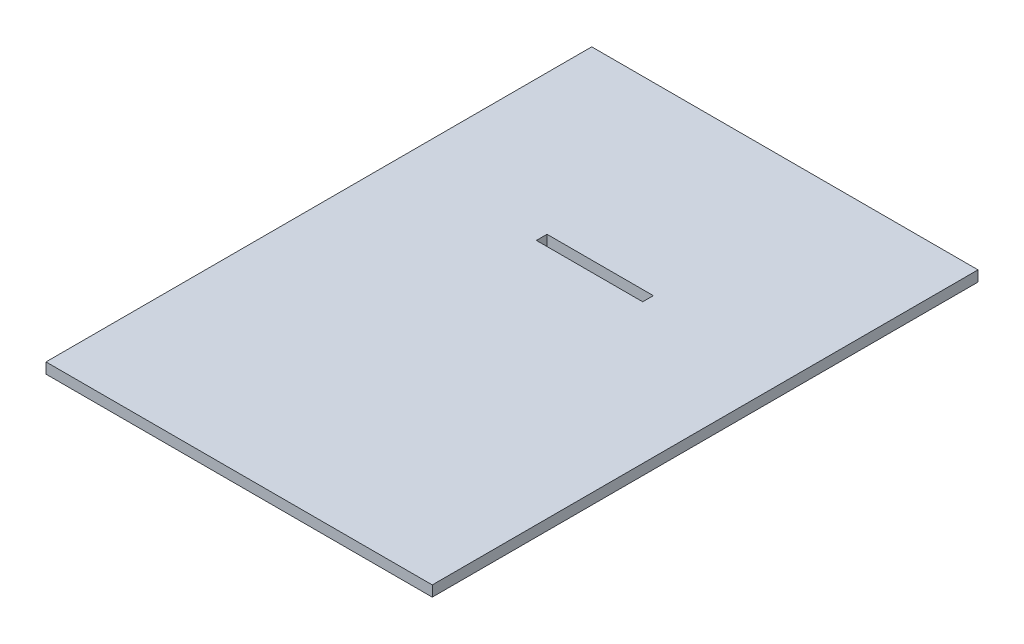
ISO-10303-21;
HEADER;
FILE_DESCRIPTION(('STEP AP214'),'2;1');
FILE_NAME('part.step','',(''),(''),'','','');
FILE_SCHEMA(('AUTOMOTIVE_DESIGN { 1 0 10303 214 1 1 1 1 }'));
ENDSEC;
DATA;
#1=APPLICATION_CONTEXT('core data for automotive mechanical design processes');
#2=APPLICATION_PROTOCOL_DEFINITION('international standard','automotive_design',2000,#1);
#3=PRODUCT_CONTEXT('',#1,'mechanical');
#4=PRODUCT('Part','Part','',(#3));
#5=PRODUCT_RELATED_PRODUCT_CATEGORY('part','',(#4));
#6=PRODUCT_DEFINITION_FORMATION('','',#4);
#7=PRODUCT_DEFINITION_CONTEXT('part definition',#1,'design');
#8=PRODUCT_DEFINITION('design','',#6,#7);
#9=PRODUCT_DEFINITION_SHAPE('','',#8);
#10=(LENGTH_UNIT() NAMED_UNIT(*) SI_UNIT(.MILLI.,.METRE.));
#11=(NAMED_UNIT(*) PLANE_ANGLE_UNIT() SI_UNIT($,.RADIAN.));
#12=(NAMED_UNIT(*) SI_UNIT($,.STERADIAN.) SOLID_ANGLE_UNIT());
#13=UNCERTAINTY_MEASURE_WITH_UNIT(LENGTH_MEASURE(1.E-05),#10,'distance_accuracy_value','');
#14=(GEOMETRIC_REPRESENTATION_CONTEXT(3) GLOBAL_UNCERTAINTY_ASSIGNED_CONTEXT((#13)) GLOBAL_UNIT_ASSIGNED_CONTEXT((#10,
#11,#12)) REPRESENTATION_CONTEXT('',''));
#15=CARTESIAN_POINT('',(0.,0.,0.));
#16=DIRECTION('',(0.,0.,1.));
#17=DIRECTION('',(1.,0.,0.));
#18=AXIS2_PLACEMENT_3D('',#15,#16,#17);
#19=CARTESIAN_POINT('',(0.,3.,0.));
#20=DIRECTION('',(0.,0.,-1.));
#21=DIRECTION('',(-1.,0.,0.));
#22=AXIS2_PLACEMENT_3D('',#19,#20,#21);
#23=PLANE('',#22);
#24=DIRECTION('',(1.,0.,0.));
#25=VECTOR('',#24,1.);
#26=CARTESIAN_POINT('',(0.,0.,0.));
#27=LINE('',#26,#25);
#28=CARTESIAN_POINT('',(0.,0.,0.));
#29=VERTEX_POINT('',#28);
#30=CARTESIAN_POINT('',(109.,0.,0.));
#31=VERTEX_POINT('',#30);
#32=EDGE_CURVE('E134',#29,#31,#27,.T.);
#33=ORIENTED_EDGE('',*,*,#32,.T.);
#34=DIRECTION('',(0.,-1.,0.));
#35=VECTOR('',#34,1.);
#36=CARTESIAN_POINT('',(109.,3.,0.));
#37=LINE('',#36,#35);
#38=CARTESIAN_POINT('',(109.,3.,0.));
#39=VERTEX_POINT('',#38);
#40=EDGE_CURVE('E11',#39,#31,#37,.T.);
#41=ORIENTED_EDGE('',*,*,#40,.F.);
#42=DIRECTION('',(1.,0.,0.));
#43=VECTOR('',#42,1.);
#44=CARTESIAN_POINT('',(0.,3.,0.));
#45=LINE('',#44,#43);
#46=CARTESIAN_POINT('',(0.,3.,0.));
#47=VERTEX_POINT('',#46);
#48=EDGE_CURVE('E138',#47,#39,#45,.T.);
#49=ORIENTED_EDGE('',*,*,#48,.F.);
#50=DIRECTION('',(0.,-1.,0.));
#51=VECTOR('',#50,1.);
#52=CARTESIAN_POINT('',(0.,3.,0.));
#53=LINE('',#52,#51);
#54=EDGE_CURVE('E150',#47,#29,#53,.T.);
#55=ORIENTED_EDGE('',*,*,#54,.T.);
#56=EDGE_LOOP('',(#33,#41,#49,#55));
#57=FACE_BOUND('',#56,.T.);
#58=ADVANCED_FACE('F37',(#57),#23,.F.);
#59=CARTESIAN_POINT('',(109.,3.,0.));
#60=DIRECTION('',(-1.,0.,0.));
#61=DIRECTION('',(0.,0.,1.));
#62=AXIS2_PLACEMENT_3D('',#59,#60,#61);
#63=PLANE('',#62);
#64=DIRECTION('',(0.,0.,-1.));
#65=VECTOR('',#64,1.);
#66=CARTESIAN_POINT('',(109.,0.,0.));
#67=LINE('',#66,#65);
#68=CARTESIAN_POINT('',(109.,0.,-154.));
#69=VERTEX_POINT('',#68);
#70=EDGE_CURVE('E153',#31,#69,#67,.T.);
#71=ORIENTED_EDGE('',*,*,#70,.T.);
#72=DIRECTION('',(0.,-1.,0.));
#73=VECTOR('',#72,1.);
#74=CARTESIAN_POINT('',(109.,3.,-154.));
#75=LINE('',#74,#73);
#76=CARTESIAN_POINT('',(109.,3.,-154.));
#77=VERTEX_POINT('',#76);
#78=EDGE_CURVE('E44',#77,#69,#75,.T.);
#79=ORIENTED_EDGE('',*,*,#78,.F.);
#80=DIRECTION('',(0.,0.,-1.));
#81=VECTOR('',#80,1.);
#82=CARTESIAN_POINT('',(109.,3.,0.));
#83=LINE('',#82,#81);
#84=EDGE_CURVE('E141',#39,#77,#83,.T.);
#85=ORIENTED_EDGE('',*,*,#84,.F.);
#86=ORIENTED_EDGE('',*,*,#40,.T.);
#87=EDGE_LOOP('',(#71,#79,#85,#86));
#88=FACE_BOUND('',#87,.T.);
#89=ADVANCED_FACE('F169',(#88),#63,.F.);
#90=CARTESIAN_POINT('',(0.,3.,-154.));
#91=DIRECTION('',(0.,0.,-1.));
#92=DIRECTION('',(-1.,0.,0.));
#93=AXIS2_PLACEMENT_3D('',#90,#91,#92);
#94=PLANE('',#93);
#95=DIRECTION('',(1.,0.,0.));
#96=VECTOR('',#95,1.);
#97=CARTESIAN_POINT('',(0.,0.,-154.));
#98=LINE('',#97,#96);
#99=CARTESIAN_POINT('',(0.,0.,-154.));
#100=VERTEX_POINT('',#99);
#101=EDGE_CURVE('E156',#100,#69,#98,.T.);
#102=ORIENTED_EDGE('',*,*,#101,.F.);
#103=DIRECTION('',(0.,-1.,0.));
#104=VECTOR('',#103,1.);
#105=CARTESIAN_POINT('',(0.,3.,-154.));
#106=LINE('',#105,#104);
#107=CARTESIAN_POINT('',(0.,3.,-154.));
#108=VERTEX_POINT('',#107);
#109=EDGE_CURVE('E162',#108,#100,#106,.T.);
#110=ORIENTED_EDGE('',*,*,#109,.F.);
#111=DIRECTION('',(1.,0.,0.));
#112=VECTOR('',#111,1.);
#113=CARTESIAN_POINT('',(0.,3.,-154.));
#114=LINE('',#113,#112);
#115=EDGE_CURVE('E144',#108,#77,#114,.T.);
#116=ORIENTED_EDGE('',*,*,#115,.T.);
#117=ORIENTED_EDGE('',*,*,#78,.T.);
#118=EDGE_LOOP('',(#102,#110,#116,#117));
#119=FACE_BOUND('',#118,.T.);
#120=ADVANCED_FACE('F166',(#119),#94,.T.);
#121=CARTESIAN_POINT('',(0.,3.,0.));
#122=DIRECTION('',(-1.,0.,0.));
#123=DIRECTION('',(0.,0.,1.));
#124=AXIS2_PLACEMENT_3D('',#121,#122,#123);
#125=PLANE('',#124);
#126=DIRECTION('',(0.,0.,-1.));
#127=VECTOR('',#126,1.);
#128=CARTESIAN_POINT('',(0.,0.,0.));
#129=LINE('',#128,#127);
#130=EDGE_CURVE('E142',#29,#100,#129,.T.);
#131=ORIENTED_EDGE('',*,*,#130,.F.);
#132=ORIENTED_EDGE('',*,*,#54,.F.);
#133=DIRECTION('',(0.,0.,-1.));
#134=VECTOR('',#133,1.);
#135=CARTESIAN_POINT('',(0.,3.,0.));
#136=LINE('',#135,#134);
#137=EDGE_CURVE('E147',#47,#108,#136,.T.);
#138=ORIENTED_EDGE('',*,*,#137,.T.);
#139=ORIENTED_EDGE('',*,*,#109,.T.);
#140=EDGE_LOOP('',(#131,#132,#138,#139));
#141=FACE_BOUND('',#140,.T.);
#142=ADVANCED_FACE('F174',(#141),#125,.T.);
#143=CARTESIAN_POINT('',(0.,3.,0.));
#144=DIRECTION('',(0.,1.,0.));
#145=DIRECTION('',(0.,0.,1.));
#146=AXIS2_PLACEMENT_3D('',#143,#144,#145);
#147=PLANE('',#146);
#148=DIRECTION('',(0.,0.,1.));
#149=VECTOR('',#148,1.);
#150=CARTESIAN_POINT('',(39.5,3.,-98.88));
#151=LINE('',#150,#149);
#152=CARTESIAN_POINT('',(39.5,3.,-101.88));
#153=VERTEX_POINT('',#152);
#154=CARTESIAN_POINT('',(39.5,3.,-98.88));
#155=VERTEX_POINT('',#154);
#156=EDGE_CURVE('E51',#153,#155,#151,.T.);
#157=ORIENTED_EDGE('',*,*,#156,.F.);
#158=DIRECTION('',(-1.,0.,0.));
#159=VECTOR('',#158,1.);
#160=CARTESIAN_POINT('',(39.5,3.,-101.88));
#161=LINE('',#160,#159);
#162=CARTESIAN_POINT('',(69.5,3.,-101.88));
#163=VERTEX_POINT('',#162);
#164=EDGE_CURVE('E119',#163,#153,#161,.T.);
#165=ORIENTED_EDGE('',*,*,#164,.F.);
#166=DIRECTION('',(0.,0.,-1.));
#167=VECTOR('',#166,1.);
#168=CARTESIAN_POINT('',(69.5,3.,-98.88));
#169=LINE('',#168,#167);
#170=CARTESIAN_POINT('',(69.5,3.,-98.88));
#171=VERTEX_POINT('',#170);
#172=EDGE_CURVE('E122',#171,#163,#169,.T.);
#173=ORIENTED_EDGE('',*,*,#172,.F.);
#174=DIRECTION('',(1.,0.,0.));
#175=VECTOR('',#174,1.);
#176=CARTESIAN_POINT('',(39.5,3.,-98.88));
#177=LINE('',#176,#175);
#178=EDGE_CURVE('E128',#155,#171,#177,.T.);
#179=ORIENTED_EDGE('',*,*,#178,.F.);
#180=EDGE_LOOP('',(#157,#165,#173,#179));
#181=FACE_BOUND('',#180,.T.);
#182=ORIENTED_EDGE('',*,*,#48,.T.);
#183=ORIENTED_EDGE('',*,*,#84,.T.);
#184=ORIENTED_EDGE('',*,*,#115,.F.);
#185=ORIENTED_EDGE('',*,*,#137,.F.);
#186=EDGE_LOOP('',(#182,#183,#184,#185));
#187=FACE_BOUND('',#186,.T.);
#188=ADVANCED_FACE('F178',(#181,#187),#147,.T.);
#189=CARTESIAN_POINT('',(0.,0.,0.));
#190=DIRECTION('',(0.,1.,0.));
#191=DIRECTION('',(0.,0.,1.));
#192=AXIS2_PLACEMENT_3D('',#189,#190,#191);
#193=PLANE('',#192);
#194=DIRECTION('',(-1.,0.,0.));
#195=VECTOR('',#194,1.);
#196=CARTESIAN_POINT('',(39.5,0.,-101.88));
#197=LINE('',#196,#195);
#198=CARTESIAN_POINT('',(69.5,0.,-101.88));
#199=VERTEX_POINT('',#198);
#200=CARTESIAN_POINT('',(39.5,0.,-101.88));
#201=VERTEX_POINT('',#200);
#202=EDGE_CURVE('E109',#199,#201,#197,.T.);
#203=ORIENTED_EDGE('',*,*,#202,.T.);
#204=DIRECTION('',(0.,0.,1.));
#205=VECTOR('',#204,1.);
#206=CARTESIAN_POINT('',(39.5,0.,-98.88));
#207=LINE('',#206,#205);
#208=CARTESIAN_POINT('',(39.5,0.,-98.88));
#209=VERTEX_POINT('',#208);
#210=EDGE_CURVE('E103',#201,#209,#207,.T.);
#211=ORIENTED_EDGE('',*,*,#210,.T.);
#212=DIRECTION('',(1.,0.,0.));
#213=VECTOR('',#212,1.);
#214=CARTESIAN_POINT('',(39.5,0.,-98.88));
#215=LINE('',#214,#213);
#216=CARTESIAN_POINT('',(69.5,0.,-98.88));
#217=VERTEX_POINT('',#216);
#218=EDGE_CURVE('E112',#209,#217,#215,.T.);
#219=ORIENTED_EDGE('',*,*,#218,.T.);
#220=DIRECTION('',(0.,0.,-1.));
#221=VECTOR('',#220,1.);
#222=CARTESIAN_POINT('',(69.5,0.,-98.88));
#223=LINE('',#222,#221);
#224=EDGE_CURVE('E59',#217,#199,#223,.T.);
#225=ORIENTED_EDGE('',*,*,#224,.T.);
#226=EDGE_LOOP('',(#203,#211,#219,#225));
#227=FACE_BOUND('',#226,.T.);
#228=ORIENTED_EDGE('',*,*,#32,.F.);
#229=ORIENTED_EDGE('',*,*,#130,.T.);
#230=ORIENTED_EDGE('',*,*,#101,.T.);
#231=ORIENTED_EDGE('',*,*,#70,.F.);
#232=EDGE_LOOP('',(#228,#229,#230,#231));
#233=FACE_BOUND('',#232,.T.);
#234=ADVANCED_FACE('F116',(#227,#233),#193,.F.);
#235=CARTESIAN_POINT('',(39.5,0.,-98.88));
#236=DIRECTION('',(-1.,0.,0.));
#237=DIRECTION('',(0.,0.,1.));
#238=AXIS2_PLACEMENT_3D('',#235,#236,#237);
#239=PLANE('',#238);
#240=ORIENTED_EDGE('',*,*,#156,.T.);
#241=DIRECTION('',(0.,1.,0.));
#242=VECTOR('',#241,1.);
#243=CARTESIAN_POINT('',(39.5,0.,-98.88));
#244=LINE('',#243,#242);
#245=EDGE_CURVE('E99',#209,#155,#244,.T.);
#246=ORIENTED_EDGE('',*,*,#245,.F.);
#247=ORIENTED_EDGE('',*,*,#210,.F.);
#248=DIRECTION('',(0.,1.,0.));
#249=VECTOR('',#248,1.);
#250=CARTESIAN_POINT('',(39.5,0.,-101.88));
#251=LINE('',#250,#249);
#252=EDGE_CURVE('E132',#201,#153,#251,.T.);
#253=ORIENTED_EDGE('',*,*,#252,.T.);
#254=EDGE_LOOP('',(#240,#246,#247,#253));
#255=FACE_BOUND('',#254,.T.);
#256=ADVANCED_FACE('F101',(#255),#239,.F.);
#257=CARTESIAN_POINT('',(39.5,0.,-101.88));
#258=DIRECTION('',(0.,0.,-1.));
#259=DIRECTION('',(-1.,0.,0.));
#260=AXIS2_PLACEMENT_3D('',#257,#258,#259);
#261=PLANE('',#260);
#262=ORIENTED_EDGE('',*,*,#164,.T.);
#263=ORIENTED_EDGE('',*,*,#252,.F.);
#264=ORIENTED_EDGE('',*,*,#202,.F.);
#265=DIRECTION('',(0.,1.,0.));
#266=VECTOR('',#265,1.);
#267=CARTESIAN_POINT('',(69.5,0.,-101.88));
#268=LINE('',#267,#266);
#269=EDGE_CURVE('E135',#199,#163,#268,.T.);
#270=ORIENTED_EDGE('',*,*,#269,.T.);
#271=EDGE_LOOP('',(#262,#263,#264,#270));
#272=FACE_BOUND('',#271,.T.);
#273=ADVANCED_FACE('F198',(#272),#261,.F.);
#274=CARTESIAN_POINT('',(69.5,0.,-98.88));
#275=DIRECTION('',(1.,0.,0.));
#276=DIRECTION('',(0.,0.,-1.));
#277=AXIS2_PLACEMENT_3D('',#274,#275,#276);
#278=PLANE('',#277);
#279=ORIENTED_EDGE('',*,*,#172,.T.);
#280=ORIENTED_EDGE('',*,*,#269,.F.);
#281=ORIENTED_EDGE('',*,*,#224,.F.);
#282=DIRECTION('',(0.,1.,0.));
#283=VECTOR('',#282,1.);
#284=CARTESIAN_POINT('',(69.5,0.,-98.88));
#285=LINE('',#284,#283);
#286=EDGE_CURVE('E108',#217,#171,#285,.T.);
#287=ORIENTED_EDGE('',*,*,#286,.T.);
#288=EDGE_LOOP('',(#279,#280,#281,#287));
#289=FACE_BOUND('',#288,.T.);
#290=ADVANCED_FACE('F201',(#289),#278,.F.);
#291=CARTESIAN_POINT('',(39.5,0.,-98.88));
#292=DIRECTION('',(0.,0.,1.));
#293=DIRECTION('',(1.,0.,0.));
#294=AXIS2_PLACEMENT_3D('',#291,#292,#293);
#295=PLANE('',#294);
#296=ORIENTED_EDGE('',*,*,#178,.T.);
#297=ORIENTED_EDGE('',*,*,#286,.F.);
#298=ORIENTED_EDGE('',*,*,#218,.F.);
#299=ORIENTED_EDGE('',*,*,#245,.T.);
#300=EDGE_LOOP('',(#296,#297,#298,#299));
#301=FACE_BOUND('',#300,.T.);
#302=ADVANCED_FACE('F113',(#301),#295,.F.);
#303=CLOSED_SHELL('',(#58,#89,#120,#142,#188,#234,#256,#273,#290,#302));
#304=MANIFOLD_SOLID_BREP('B2',#303);
#305=ADVANCED_BREP_SHAPE_REPRESENTATION('',(#18,#304),#14);
#306=SHAPE_DEFINITION_REPRESENTATION(#9,#305);
ENDSEC;
END-ISO-10303-21;
